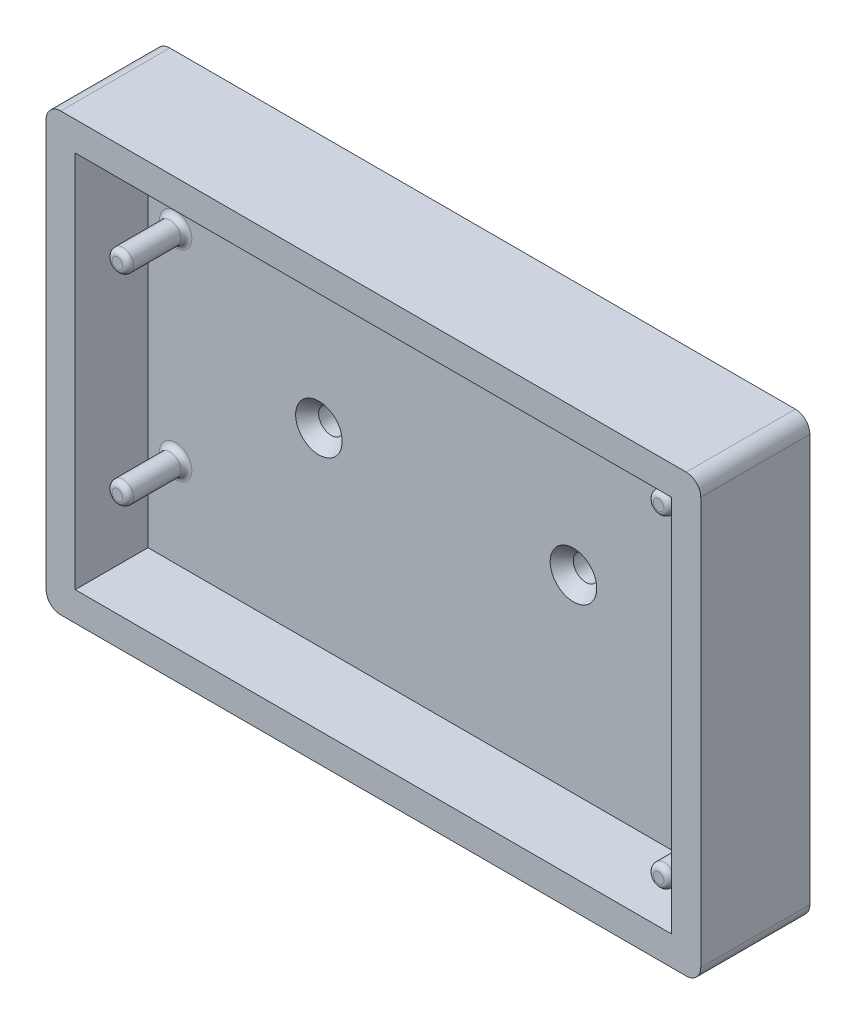
ISO-10303-21;
HEADER;
FILE_DESCRIPTION(('STEP AP214'),'2;1');
FILE_NAME('part.step','',(''),(''),'','','');
FILE_SCHEMA(('AUTOMOTIVE_DESIGN { 1 0 10303 214 1 1 1 1 }'));
ENDSEC;
DATA;
#1=APPLICATION_CONTEXT('core data for automotive mechanical design processes');
#2=APPLICATION_PROTOCOL_DEFINITION('international standard','automotive_design',2000,#1);
#3=PRODUCT_CONTEXT('',#1,'mechanical');
#4=PRODUCT('Part','Part','',(#3));
#5=PRODUCT_RELATED_PRODUCT_CATEGORY('part','',(#4));
#6=PRODUCT_DEFINITION_FORMATION('','',#4);
#7=PRODUCT_DEFINITION_CONTEXT('part definition',#1,'design');
#8=PRODUCT_DEFINITION('design','',#6,#7);
#9=PRODUCT_DEFINITION_SHAPE('','',#8);
#10=(LENGTH_UNIT() NAMED_UNIT(*) SI_UNIT(.MILLI.,.METRE.));
#11=(NAMED_UNIT(*) PLANE_ANGLE_UNIT() SI_UNIT($,.RADIAN.));
#12=(NAMED_UNIT(*) SI_UNIT($,.STERADIAN.) SOLID_ANGLE_UNIT());
#13=UNCERTAINTY_MEASURE_WITH_UNIT(LENGTH_MEASURE(1.E-05),#10,'distance_accuracy_value','');
#14=(GEOMETRIC_REPRESENTATION_CONTEXT(3) GLOBAL_UNCERTAINTY_ASSIGNED_CONTEXT((#13)) GLOBAL_UNIT_ASSIGNED_CONTEXT((#10,
#11,#12)) REPRESENTATION_CONTEXT('',''));
#15=CARTESIAN_POINT('',(0.,0.,0.));
#16=DIRECTION('',(0.,0.,1.));
#17=DIRECTION('',(1.,0.,0.));
#18=AXIS2_PLACEMENT_3D('',#15,#16,#17);
#19=CARTESIAN_POINT('',(-45.,30.,5.));
#20=DIRECTION('',(0.,1.,0.));
#21=DIRECTION('',(0.,0.,1.));
#22=AXIS2_PLACEMENT_3D('',#19,#20,#21);
#23=PLANE('',#22);
#24=DIRECTION('',(1.,0.,0.));
#25=VECTOR('',#24,1.);
#26=CARTESIAN_POINT('',(-45.,30.,0.));
#27=LINE('',#26,#25);
#28=CARTESIAN_POINT('',(-43.,30.,0.));
#29=VERTEX_POINT('',#28);
#30=CARTESIAN_POINT('',(43.,30.,0.));
#31=VERTEX_POINT('',#30);
#32=EDGE_CURVE('E178',#29,#31,#27,.T.);
#33=ORIENTED_EDGE('',*,*,#32,.F.);
#34=DIRECTION('',(0.,0.,-1.));
#35=VECTOR('',#34,1.);
#36=CARTESIAN_POINT('',(-43.,30.,15.));
#37=LINE('',#36,#35);
#38=CARTESIAN_POINT('',(-43.,30.,15.));
#39=VERTEX_POINT('',#38);
#40=EDGE_CURVE('E48',#29,#39,#37,.F.);
#41=ORIENTED_EDGE('',*,*,#40,.T.);
#42=DIRECTION('',(-1.,0.,0.));
#43=VECTOR('',#42,1.);
#44=CARTESIAN_POINT('',(-45.,30.,15.));
#45=LINE('',#44,#43);
#46=CARTESIAN_POINT('',(43.,30.,15.));
#47=VERTEX_POINT('',#46);
#48=EDGE_CURVE('E170',#47,#39,#45,.T.);
#49=ORIENTED_EDGE('',*,*,#48,.F.);
#50=DIRECTION('',(0.,0.,-1.));
#51=VECTOR('',#50,1.);
#52=CARTESIAN_POINT('',(43.,30.,5.));
#53=LINE('',#52,#51);
#54=EDGE_CURVE('E215',#47,#31,#53,.T.);
#55=ORIENTED_EDGE('',*,*,#54,.T.);
#56=EDGE_LOOP('',(#33,#41,#49,#55));
#57=FACE_BOUND('',#56,.T.);
#58=ADVANCED_FACE('F33',(#57),#23,.T.);
#59=CARTESIAN_POINT('',(-45.,30.,5.));
#60=DIRECTION('',(1.,0.,0.));
#61=DIRECTION('',(0.,1.,0.));
#62=AXIS2_PLACEMENT_3D('',#59,#60,#61);
#63=PLANE('',#62);
#64=DIRECTION('',(0.,-1.,0.));
#65=VECTOR('',#64,1.);
#66=CARTESIAN_POINT('',(-45.,30.,0.));
#67=LINE('',#66,#65);
#68=CARTESIAN_POINT('',(-45.,28.,0.));
#69=VERTEX_POINT('',#68);
#70=CARTESIAN_POINT('',(-45.,-28.,0.));
#71=VERTEX_POINT('',#70);
#72=EDGE_CURVE('E187',#69,#71,#67,.T.);
#73=ORIENTED_EDGE('',*,*,#72,.T.);
#74=DIRECTION('',(0.,0.,-1.));
#75=VECTOR('',#74,1.);
#76=CARTESIAN_POINT('',(-45.,-28.,5.));
#77=LINE('',#76,#75);
#78=CARTESIAN_POINT('',(-45.,-28.,15.));
#79=VERTEX_POINT('',#78);
#80=EDGE_CURVE('E206',#71,#79,#77,.F.);
#81=ORIENTED_EDGE('',*,*,#80,.T.);
#82=DIRECTION('',(0.,-1.,0.));
#83=VECTOR('',#82,1.);
#84=CARTESIAN_POINT('',(-45.,30.,15.));
#85=LINE('',#84,#83);
#86=CARTESIAN_POINT('',(-45.,28.,15.));
#87=VERTEX_POINT('',#86);
#88=EDGE_CURVE('E172',#87,#79,#85,.T.);
#89=ORIENTED_EDGE('',*,*,#88,.F.);
#90=DIRECTION('',(0.,0.,-1.));
#91=VECTOR('',#90,1.);
#92=CARTESIAN_POINT('',(-45.,28.,0.));
#93=LINE('',#92,#91);
#94=EDGE_CURVE('E203',#87,#69,#93,.T.);
#95=ORIENTED_EDGE('',*,*,#94,.T.);
#96=EDGE_LOOP('',(#73,#81,#89,#95));
#97=FACE_BOUND('',#96,.T.);
#98=ADVANCED_FACE('F284',(#97),#63,.F.);
#99=CARTESIAN_POINT('',(-45.,-30.,5.));
#100=DIRECTION('',(0.,1.,0.));
#101=DIRECTION('',(0.,0.,1.));
#102=AXIS2_PLACEMENT_3D('',#99,#100,#101);
#103=PLANE('',#102);
#104=DIRECTION('',(1.,0.,0.));
#105=VECTOR('',#104,1.);
#106=CARTESIAN_POINT('',(-45.,-30.,15.));
#107=LINE('',#106,#105);
#108=CARTESIAN_POINT('',(-43.,-30.,15.));
#109=VERTEX_POINT('',#108);
#110=CARTESIAN_POINT('',(43.,-30.,15.));
#111=VERTEX_POINT('',#110);
#112=EDGE_CURVE('E175',#109,#111,#107,.T.);
#113=ORIENTED_EDGE('',*,*,#112,.F.);
#114=DIRECTION('',(0.,0.,-1.));
#115=VECTOR('',#114,1.);
#116=CARTESIAN_POINT('',(-43.,-30.,5.));
#117=LINE('',#116,#115);
#118=CARTESIAN_POINT('',(-43.,-30.,0.));
#119=VERTEX_POINT('',#118);
#120=EDGE_CURVE('E192',#109,#119,#117,.T.);
#121=ORIENTED_EDGE('',*,*,#120,.T.);
#122=DIRECTION('',(1.,0.,0.));
#123=VECTOR('',#122,1.);
#124=CARTESIAN_POINT('',(-45.,-30.,0.));
#125=LINE('',#124,#123);
#126=CARTESIAN_POINT('',(43.,-30.,0.));
#127=VERTEX_POINT('',#126);
#128=EDGE_CURVE('E184',#119,#127,#125,.T.);
#129=ORIENTED_EDGE('',*,*,#128,.T.);
#130=DIRECTION('',(0.,0.,-1.));
#131=VECTOR('',#130,1.);
#132=CARTESIAN_POINT('',(43.,-30.,15.));
#133=LINE('',#132,#131);
#134=EDGE_CURVE('E190',#127,#111,#133,.F.);
#135=ORIENTED_EDGE('',*,*,#134,.T.);
#136=EDGE_LOOP('',(#113,#121,#129,#135));
#137=FACE_BOUND('',#136,.T.);
#138=ADVANCED_FACE('F289',(#137),#103,.F.);
#139=CARTESIAN_POINT('',(45.,30.,5.));
#140=DIRECTION('',(1.,0.,0.));
#141=DIRECTION('',(0.,0.,-1.));
#142=AXIS2_PLACEMENT_3D('',#139,#140,#141);
#143=PLANE('',#142);
#144=DIRECTION('',(0.,-1.,0.));
#145=VECTOR('',#144,1.);
#146=CARTESIAN_POINT('',(45.,30.,0.));
#147=LINE('',#146,#145);
#148=CARTESIAN_POINT('',(45.,28.,0.));
#149=VERTEX_POINT('',#148);
#150=CARTESIAN_POINT('',(45.,-28.,0.));
#151=VERTEX_POINT('',#150);
#152=EDGE_CURVE('E181',#149,#151,#147,.T.);
#153=ORIENTED_EDGE('',*,*,#152,.F.);
#154=DIRECTION('',(0.,0.,-1.));
#155=VECTOR('',#154,1.);
#156=CARTESIAN_POINT('',(45.,28.,5.));
#157=LINE('',#156,#155);
#158=CARTESIAN_POINT('',(45.,28.,15.));
#159=VERTEX_POINT('',#158);
#160=EDGE_CURVE('E222',#149,#159,#157,.F.);
#161=ORIENTED_EDGE('',*,*,#160,.T.);
#162=DIRECTION('',(0.,1.,0.));
#163=VECTOR('',#162,1.);
#164=CARTESIAN_POINT('',(45.,30.,15.));
#165=LINE('',#164,#163);
#166=CARTESIAN_POINT('',(45.,-28.,15.));
#167=VERTEX_POINT('',#166);
#168=EDGE_CURVE('E143',#167,#159,#165,.T.);
#169=ORIENTED_EDGE('',*,*,#168,.F.);
#170=DIRECTION('',(0.,0.,-1.));
#171=VECTOR('',#170,1.);
#172=CARTESIAN_POINT('',(45.,-28.,0.));
#173=LINE('',#172,#171);
#174=EDGE_CURVE('E219',#167,#151,#173,.T.);
#175=ORIENTED_EDGE('',*,*,#174,.T.);
#176=EDGE_LOOP('',(#153,#161,#169,#175));
#177=FACE_BOUND('',#176,.T.);
#178=ADVANCED_FACE('F294',(#177),#143,.T.);
#179=CARTESIAN_POINT('',(0.,0.,0.));
#180=DIRECTION('',(0.,0.,-1.));
#181=DIRECTION('',(-1.,0.,0.));
#182=AXIS2_PLACEMENT_3D('',#179,#180,#181);
#183=PLANE('',#182);
#184=CARTESIAN_POINT('',(-17.5,0.,0.));
#185=DIRECTION('',(0.,0.,1.));
#186=DIRECTION('',(1.,0.,0.));
#187=AXIS2_PLACEMENT_3D('',#184,#185,#186);
#188=CIRCLE('',#187,1.7272);
#189=CARTESIAN_POINT('',(-15.7728,0.,0.));
#190=VERTEX_POINT('',#189);
#191=EDGE_CURVE('E606',#190,#190,#188,.T.);
#192=ORIENTED_EDGE('',*,*,#191,.T.);
#193=EDGE_LOOP('',(#192));
#194=FACE_BOUND('',#193,.T.);
#195=CARTESIAN_POINT('',(17.5,0.,0.));
#196=DIRECTION('',(0.,0.,1.));
#197=DIRECTION('',(1.,0.,0.));
#198=AXIS2_PLACEMENT_3D('',#195,#196,#197);
#199=CIRCLE('',#198,1.7272);
#200=CARTESIAN_POINT('',(19.2272,0.,0.));
#201=VERTEX_POINT('',#200);
#202=EDGE_CURVE('E158',#201,#201,#199,.T.);
#203=ORIENTED_EDGE('',*,*,#202,.T.);
#204=EDGE_LOOP('',(#203));
#205=FACE_BOUND('',#204,.T.);
#206=ORIENTED_EDGE('',*,*,#128,.F.);
#207=CARTESIAN_POINT('',(-43.,-28.,0.));
#208=DIRECTION('',(0.,0.,-1.));
#209=DIRECTION('',(-1.,0.,0.));
#210=AXIS2_PLACEMENT_3D('',#207,#208,#209);
#211=CIRCLE('',#210,2.);
#212=EDGE_CURVE('E201',#119,#71,#211,.T.);
#213=ORIENTED_EDGE('',*,*,#212,.T.);
#214=ORIENTED_EDGE('',*,*,#72,.F.);
#215=CARTESIAN_POINT('',(-43.,28.,0.));
#216=DIRECTION('',(0.,0.,-1.));
#217=DIRECTION('',(-1.,0.,0.));
#218=AXIS2_PLACEMENT_3D('',#215,#216,#217);
#219=CIRCLE('',#218,2.);
#220=EDGE_CURVE('E199',#69,#29,#219,.T.);
#221=ORIENTED_EDGE('',*,*,#220,.T.);
#222=ORIENTED_EDGE('',*,*,#32,.T.);
#223=CARTESIAN_POINT('',(43.,28.,0.));
#224=DIRECTION('',(0.,0.,-1.));
#225=DIRECTION('',(-1.,0.,0.));
#226=AXIS2_PLACEMENT_3D('',#223,#224,#225);
#227=CIRCLE('',#226,2.);
#228=EDGE_CURVE('E197',#31,#149,#227,.T.);
#229=ORIENTED_EDGE('',*,*,#228,.T.);
#230=ORIENTED_EDGE('',*,*,#152,.T.);
#231=CARTESIAN_POINT('',(43.,-28.,0.));
#232=DIRECTION('',(0.,0.,-1.));
#233=DIRECTION('',(-1.,0.,0.));
#234=AXIS2_PLACEMENT_3D('',#231,#232,#233);
#235=CIRCLE('',#234,2.);
#236=EDGE_CURVE('E195',#151,#127,#235,.T.);
#237=ORIENTED_EDGE('',*,*,#236,.T.);
#238=EDGE_LOOP('',(#206,#213,#214,#221,#222,#229,#230,#237));
#239=FACE_BOUND('',#238,.T.);
#240=ADVANCED_FACE('F371',(#194,#205,#239),#183,.T.);
#241=CARTESIAN_POINT('',(0.,0.,15.));
#242=DIRECTION('',(0.,0.,1.));
#243=DIRECTION('',(1.,0.,0.));
#244=AXIS2_PLACEMENT_3D('',#241,#242,#243);
#245=PLANE('',#244);
#246=ORIENTED_EDGE('',*,*,#88,.T.);
#247=CARTESIAN_POINT('',(-43.,-28.,15.));
#248=DIRECTION('',(0.,0.,1.));
#249=DIRECTION('',(1.,0.,0.));
#250=AXIS2_PLACEMENT_3D('',#247,#248,#249);
#251=CIRCLE('',#250,2.);
#252=EDGE_CURVE('E213',#79,#109,#251,.T.);
#253=ORIENTED_EDGE('',*,*,#252,.T.);
#254=ORIENTED_EDGE('',*,*,#112,.T.);
#255=CARTESIAN_POINT('',(43.,-28.,15.));
#256=DIRECTION('',(0.,0.,1.));
#257=DIRECTION('',(1.,0.,0.));
#258=AXIS2_PLACEMENT_3D('',#255,#256,#257);
#259=CIRCLE('',#258,2.);
#260=EDGE_CURVE('E208',#111,#167,#259,.T.);
#261=ORIENTED_EDGE('',*,*,#260,.T.);
#262=ORIENTED_EDGE('',*,*,#168,.T.);
#263=CARTESIAN_POINT('',(43.,28.,15.));
#264=DIRECTION('',(0.,0.,1.));
#265=DIRECTION('',(1.,0.,0.));
#266=AXIS2_PLACEMENT_3D('',#263,#264,#265);
#267=CIRCLE('',#266,2.);
#268=EDGE_CURVE('E55',#159,#47,#267,.T.);
#269=ORIENTED_EDGE('',*,*,#268,.T.);
#270=ORIENTED_EDGE('',*,*,#48,.T.);
#271=CARTESIAN_POINT('',(-43.,28.,15.));
#272=DIRECTION('',(0.,0.,1.));
#273=DIRECTION('',(1.,0.,0.));
#274=AXIS2_PLACEMENT_3D('',#271,#272,#273);
#275=CIRCLE('',#274,2.);
#276=EDGE_CURVE('E211',#39,#87,#275,.T.);
#277=ORIENTED_EDGE('',*,*,#276,.T.);
#278=EDGE_LOOP('',(#246,#253,#254,#261,#262,#269,#270,#277));
#279=FACE_BOUND('',#278,.T.);
#280=DIRECTION('',(-1.,0.,0.));
#281=VECTOR('',#280,1.);
#282=CARTESIAN_POINT('',(-41.,26.,15.));
#283=LINE('',#282,#281);
#284=CARTESIAN_POINT('',(41.,26.,15.));
#285=VERTEX_POINT('',#284);
#286=CARTESIAN_POINT('',(-41.,26.,15.));
#287=VERTEX_POINT('',#286);
#288=EDGE_CURVE('E135',#285,#287,#283,.T.);
#289=ORIENTED_EDGE('',*,*,#288,.F.);
#290=DIRECTION('',(0.,1.,0.));
#291=VECTOR('',#290,1.);
#292=CARTESIAN_POINT('',(41.,26.,15.));
#293=LINE('',#292,#291);
#294=CARTESIAN_POINT('',(41.,-26.,15.));
#295=VERTEX_POINT('',#294);
#296=EDGE_CURVE('E125',#295,#285,#293,.T.);
#297=ORIENTED_EDGE('',*,*,#296,.F.);
#298=DIRECTION('',(1.,0.,0.));
#299=VECTOR('',#298,1.);
#300=CARTESIAN_POINT('',(-41.,-26.,15.));
#301=LINE('',#300,#299);
#302=CARTESIAN_POINT('',(-41.,-26.,15.));
#303=VERTEX_POINT('',#302);
#304=EDGE_CURVE('E151',#303,#295,#301,.T.);
#305=ORIENTED_EDGE('',*,*,#304,.F.);
#306=DIRECTION('',(0.,-1.,0.));
#307=VECTOR('',#306,1.);
#308=CARTESIAN_POINT('',(-41.,26.,15.));
#309=LINE('',#308,#307);
#310=EDGE_CURVE('E149',#287,#303,#309,.T.);
#311=ORIENTED_EDGE('',*,*,#310,.F.);
#312=EDGE_LOOP('',(#289,#297,#305,#311));
#313=FACE_BOUND('',#312,.T.);
#314=ADVANCED_FACE('F147',(#279,#313),#245,.T.);
#315=CARTESIAN_POINT('',(41.,26.,15.));
#316=DIRECTION('',(-1.,0.,0.));
#317=DIRECTION('',(0.,0.,1.));
#318=AXIS2_PLACEMENT_3D('',#315,#316,#317);
#319=PLANE('',#318);
#320=DIRECTION('',(0.,1.,0.));
#321=VECTOR('',#320,1.);
#322=CARTESIAN_POINT('',(41.,26.,5.));
#323=LINE('',#322,#321);
#324=CARTESIAN_POINT('',(41.,-26.,5.));
#325=VERTEX_POINT('',#324);
#326=CARTESIAN_POINT('',(41.,26.,5.));
#327=VERTEX_POINT('',#326);
#328=EDGE_CURVE('E156',#325,#327,#323,.T.);
#329=ORIENTED_EDGE('',*,*,#328,.F.);
#330=DIRECTION('',(0.,0.,-1.));
#331=VECTOR('',#330,1.);
#332=CARTESIAN_POINT('',(41.,-26.,15.));
#333=LINE('',#332,#331);
#334=EDGE_CURVE('E131',#295,#325,#333,.T.);
#335=ORIENTED_EDGE('',*,*,#334,.F.);
#336=ORIENTED_EDGE('',*,*,#296,.T.);
#337=DIRECTION('',(0.,0.,-1.));
#338=VECTOR('',#337,1.);
#339=CARTESIAN_POINT('',(41.,26.,15.));
#340=LINE('',#339,#338);
#341=EDGE_CURVE('E129',#285,#327,#340,.T.);
#342=ORIENTED_EDGE('',*,*,#341,.T.);
#343=EDGE_LOOP('',(#329,#335,#336,#342));
#344=FACE_BOUND('',#343,.T.);
#345=ADVANCED_FACE('F128',(#344),#319,.T.);
#346=CARTESIAN_POINT('',(-41.,26.,15.));
#347=DIRECTION('',(0.,-1.,0.));
#348=DIRECTION('',(0.,0.,-1.));
#349=AXIS2_PLACEMENT_3D('',#346,#347,#348);
#350=PLANE('',#349);
#351=DIRECTION('',(-1.,0.,0.));
#352=VECTOR('',#351,1.);
#353=CARTESIAN_POINT('',(-41.,26.,5.));
#354=LINE('',#353,#352);
#355=CARTESIAN_POINT('',(-41.,26.,5.));
#356=VERTEX_POINT('',#355);
#357=EDGE_CURVE('E142',#327,#356,#354,.T.);
#358=ORIENTED_EDGE('',*,*,#357,.F.);
#359=ORIENTED_EDGE('',*,*,#341,.F.);
#360=ORIENTED_EDGE('',*,*,#288,.T.);
#361=DIRECTION('',(0.,0.,-1.));
#362=VECTOR('',#361,1.);
#363=CARTESIAN_POINT('',(-41.,26.,15.));
#364=LINE('',#363,#362);
#365=EDGE_CURVE('E144',#287,#356,#364,.T.);
#366=ORIENTED_EDGE('',*,*,#365,.T.);
#367=EDGE_LOOP('',(#358,#359,#360,#366));
#368=FACE_BOUND('',#367,.T.);
#369=ADVANCED_FACE('F139',(#368),#350,.T.);
#370=CARTESIAN_POINT('',(-41.,26.,15.));
#371=DIRECTION('',(1.,0.,0.));
#372=DIRECTION('',(0.,0.,-1.));
#373=AXIS2_PLACEMENT_3D('',#370,#371,#372);
#374=PLANE('',#373);
#375=DIRECTION('',(0.,-1.,0.));
#376=VECTOR('',#375,1.);
#377=CARTESIAN_POINT('',(-41.,26.,5.));
#378=LINE('',#377,#376);
#379=CARTESIAN_POINT('',(-41.,-26.,5.));
#380=VERTEX_POINT('',#379);
#381=EDGE_CURVE('E160',#356,#380,#378,.T.);
#382=ORIENTED_EDGE('',*,*,#381,.F.);
#383=ORIENTED_EDGE('',*,*,#365,.F.);
#384=ORIENTED_EDGE('',*,*,#310,.T.);
#385=DIRECTION('',(0.,0.,-1.));
#386=VECTOR('',#385,1.);
#387=CARTESIAN_POINT('',(-41.,-26.,15.));
#388=LINE('',#387,#386);
#389=EDGE_CURVE('E166',#303,#380,#388,.T.);
#390=ORIENTED_EDGE('',*,*,#389,.T.);
#391=EDGE_LOOP('',(#382,#383,#384,#390));
#392=FACE_BOUND('',#391,.T.);
#393=ADVANCED_FACE('F360',(#392),#374,.T.);
#394=CARTESIAN_POINT('',(-41.,-26.,15.));
#395=DIRECTION('',(0.,1.,0.));
#396=DIRECTION('',(0.,0.,1.));
#397=AXIS2_PLACEMENT_3D('',#394,#395,#396);
#398=PLANE('',#397);
#399=DIRECTION('',(1.,0.,0.));
#400=VECTOR('',#399,1.);
#401=CARTESIAN_POINT('',(-41.,-26.,5.));
#402=LINE('',#401,#400);
#403=EDGE_CURVE('E136',#380,#325,#402,.T.);
#404=ORIENTED_EDGE('',*,*,#403,.F.);
#405=ORIENTED_EDGE('',*,*,#389,.F.);
#406=ORIENTED_EDGE('',*,*,#304,.T.);
#407=ORIENTED_EDGE('',*,*,#334,.T.);
#408=EDGE_LOOP('',(#404,#405,#406,#407));
#409=FACE_BOUND('',#408,.T.);
#410=ADVANCED_FACE('F357',(#409),#398,.T.);
#411=CARTESIAN_POINT('',(0.,0.,5.));
#412=DIRECTION('',(0.,0.,-1.));
#413=DIRECTION('',(-1.,0.,0.));
#414=AXIS2_PLACEMENT_3D('',#411,#412,#413);
#415=PLANE('',#414);
#416=CARTESIAN_POINT('',(37.2,22.2,5.));
#417=DIRECTION('',(0.,0.,-1.));
#418=DIRECTION('',(-1.,0.,0.));
#419=AXIS2_PLACEMENT_3D('',#416,#417,#418);
#420=CIRCLE('',#419,2.225);
#421=CARTESIAN_POINT('',(34.975,22.2,5.));
#422=VERTEX_POINT('',#421);
#423=EDGE_CURVE('E251',#422,#422,#420,.T.);
#424=ORIENTED_EDGE('',*,*,#423,.T.);
#425=EDGE_LOOP('',(#424));
#426=FACE_BOUND('',#425,.T.);
#427=CARTESIAN_POINT('',(-37.2,13.800000038,5.));
#428=DIRECTION('',(0.,0.,-1.));
#429=DIRECTION('',(-1.,0.,0.));
#430=AXIS2_PLACEMENT_3D('',#427,#428,#429);
#431=CIRCLE('',#430,2.225);
#432=CARTESIAN_POINT('',(-39.425,13.800000038,5.));
#433=VERTEX_POINT('',#432);
#434=EDGE_CURVE('E248',#433,#433,#431,.T.);
#435=ORIENTED_EDGE('',*,*,#434,.T.);
#436=EDGE_LOOP('',(#435));
#437=FACE_BOUND('',#436,.T.);
#438=CARTESIAN_POINT('',(-37.2,-13.800000038,5.));
#439=DIRECTION('',(0.,0.,-1.));
#440=DIRECTION('',(-1.,0.,0.));
#441=AXIS2_PLACEMENT_3D('',#438,#439,#440);
#442=CIRCLE('',#441,2.225);
#443=CARTESIAN_POINT('',(-39.425,-13.800000038,5.));
#444=VERTEX_POINT('',#443);
#445=EDGE_CURVE('E245',#444,#444,#442,.T.);
#446=ORIENTED_EDGE('',*,*,#445,.T.);
#447=EDGE_LOOP('',(#446));
#448=FACE_BOUND('',#447,.T.);
#449=CARTESIAN_POINT('',(37.2,-22.2,5.));
#450=DIRECTION('',(0.,0.,-1.));
#451=DIRECTION('',(-1.,0.,0.));
#452=AXIS2_PLACEMENT_3D('',#449,#450,#451);
#453=CIRCLE('',#452,2.225);
#454=CARTESIAN_POINT('',(34.975,-22.2,5.));
#455=VERTEX_POINT('',#454);
#456=EDGE_CURVE('E242',#455,#455,#453,.T.);
#457=ORIENTED_EDGE('',*,*,#456,.T.);
#458=EDGE_LOOP('',(#457));
#459=FACE_BOUND('',#458,.T.);
#460=CARTESIAN_POINT('',(-17.5,0.,5.));
#461=DIRECTION('',(0.,0.,1.));
#462=DIRECTION('',(1.,0.,0.));
#463=AXIS2_PLACEMENT_3D('',#460,#461,#462);
#464=CIRCLE('',#463,3.2004);
#465=CARTESIAN_POINT('',(-14.2996,0.,5.));
#466=VERTEX_POINT('',#465);
#467=EDGE_CURVE('E614',#466,#466,#464,.T.);
#468=ORIENTED_EDGE('',*,*,#467,.F.);
#469=EDGE_LOOP('',(#468));
#470=FACE_BOUND('',#469,.T.);
#471=CARTESIAN_POINT('',(17.5,0.,5.));
#472=DIRECTION('',(0.,0.,1.));
#473=DIRECTION('',(1.,0.,0.));
#474=AXIS2_PLACEMENT_3D('',#471,#472,#473);
#475=CIRCLE('',#474,3.2004);
#476=CARTESIAN_POINT('',(20.7004,0.,5.));
#477=VERTEX_POINT('',#476);
#478=EDGE_CURVE('E603',#477,#477,#475,.T.);
#479=ORIENTED_EDGE('',*,*,#478,.F.);
#480=EDGE_LOOP('',(#479));
#481=FACE_BOUND('',#480,.T.);
#482=ORIENTED_EDGE('',*,*,#403,.T.);
#483=ORIENTED_EDGE('',*,*,#328,.T.);
#484=ORIENTED_EDGE('',*,*,#357,.T.);
#485=ORIENTED_EDGE('',*,*,#381,.T.);
#486=EDGE_LOOP('',(#482,#483,#484,#485));
#487=FACE_BOUND('',#486,.T.);
#488=ADVANCED_FACE('F355',(#426,#437,#448,#459,#470,#481,#487),#415,.F.);
#489=CARTESIAN_POINT('',(-37.2,13.800000038,13.));
#490=DIRECTION('',(0.,0.,-1.));
#491=DIRECTION('',(-1.,0.,0.));
#492=AXIS2_PLACEMENT_3D('',#489,#490,#491);
#493=CYLINDRICAL_SURFACE('',#492,1.475);
#494=CARTESIAN_POINT('',(-37.2,13.800000038,12.25));
#495=DIRECTION('',(0.,0.,1.));
#496=DIRECTION('',(1.,0.,0.));
#497=AXIS2_PLACEMENT_3D('',#494,#495,#496);
#498=CIRCLE('',#497,1.475);
#499=CARTESIAN_POINT('',(-35.725,13.800000038,12.25));
#500=VERTEX_POINT('',#499);
#501=EDGE_CURVE('E239',#500,#500,#498,.F.);
#502=ORIENTED_EDGE('',*,*,#501,.T.);
#503=EDGE_LOOP('',(#502));
#504=FACE_BOUND('',#503,.T.);
#505=CARTESIAN_POINT('',(-37.2,13.800000038,5.75));
#506=DIRECTION('',(0.,0.,-1.));
#507=DIRECTION('',(-1.,0.,0.));
#508=AXIS2_PLACEMENT_3D('',#505,#506,#507);
#509=CIRCLE('',#508,1.475);
#510=CARTESIAN_POINT('',(-38.675,13.800000038,5.75));
#511=VERTEX_POINT('',#510);
#512=EDGE_CURVE('E236',#511,#511,#509,.F.);
#513=ORIENTED_EDGE('',*,*,#512,.T.);
#514=EDGE_LOOP('',(#513));
#515=FACE_BOUND('',#514,.T.);
#516=ADVANCED_FACE('F348',(#504,#515),#493,.T.);
#517=CARTESIAN_POINT('',(-37.2,13.800000038,13.));
#518=DIRECTION('',(0.,0.,1.));
#519=DIRECTION('',(1.,0.,0.));
#520=AXIS2_PLACEMENT_3D('',#517,#518,#519);
#521=PLANE('',#520);
#522=CARTESIAN_POINT('',(-37.2,13.800000038,13.));
#523=DIRECTION('',(0.,0.,1.));
#524=DIRECTION('',(1.,0.,0.));
#525=AXIS2_PLACEMENT_3D('',#522,#523,#524);
#526=CIRCLE('',#525,0.724999999999998);
#527=CARTESIAN_POINT('',(-36.475,13.800000038,13.));
#528=VERTEX_POINT('',#527);
#529=EDGE_CURVE('E233',#528,#528,#526,.T.);
#530=ORIENTED_EDGE('',*,*,#529,.T.);
#531=EDGE_LOOP('',(#530));
#532=FACE_BOUND('',#531,.T.);
#533=ADVANCED_FACE('F340',(#532),#521,.T.);
#534=CARTESIAN_POINT('',(-37.2,-13.800000038,13.));
#535=DIRECTION('',(0.,0.,-1.));
#536=DIRECTION('',(-1.,0.,0.));
#537=AXIS2_PLACEMENT_3D('',#534,#535,#536);
#538=CYLINDRICAL_SURFACE('',#537,1.475);
#539=CARTESIAN_POINT('',(-37.2,-13.800000038,5.75));
#540=DIRECTION('',(0.,0.,-1.));
#541=DIRECTION('',(-1.,0.,0.));
#542=AXIS2_PLACEMENT_3D('',#539,#540,#541);
#543=CIRCLE('',#542,1.475);
#544=CARTESIAN_POINT('',(-38.675,-13.800000038,5.75));
#545=VERTEX_POINT('',#544);
#546=EDGE_CURVE('E257',#545,#545,#543,.F.);
#547=ORIENTED_EDGE('',*,*,#546,.T.);
#548=EDGE_LOOP('',(#547));
#549=FACE_BOUND('',#548,.T.);
#550=CARTESIAN_POINT('',(-37.2,-13.800000038,12.25));
#551=DIRECTION('',(0.,0.,1.));
#552=DIRECTION('',(1.,0.,0.));
#553=AXIS2_PLACEMENT_3D('',#550,#551,#552);
#554=CIRCLE('',#553,1.475);
#555=CARTESIAN_POINT('',(-35.725,-13.800000038,12.25));
#556=VERTEX_POINT('',#555);
#557=EDGE_CURVE('E254',#556,#556,#554,.F.);
#558=ORIENTED_EDGE('',*,*,#557,.T.);
#559=EDGE_LOOP('',(#558));
#560=FACE_BOUND('',#559,.T.);
#561=ADVANCED_FACE('F337',(#549,#560),#538,.T.);
#562=CARTESIAN_POINT('',(-37.2,-13.800000038,13.));
#563=DIRECTION('',(0.,0.,1.));
#564=DIRECTION('',(1.,0.,0.));
#565=AXIS2_PLACEMENT_3D('',#562,#563,#564);
#566=PLANE('',#565);
#567=CARTESIAN_POINT('',(-37.2,-13.800000038,13.));
#568=DIRECTION('',(0.,0.,1.));
#569=DIRECTION('',(1.,0.,0.));
#570=AXIS2_PLACEMENT_3D('',#567,#568,#569);
#571=CIRCLE('',#570,0.724999999999998);
#572=CARTESIAN_POINT('',(-36.475,-13.800000038,13.));
#573=VERTEX_POINT('',#572);
#574=EDGE_CURVE('E41',#573,#573,#571,.T.);
#575=ORIENTED_EDGE('',*,*,#574,.T.);
#576=EDGE_LOOP('',(#575));
#577=FACE_BOUND('',#576,.T.);
#578=ADVANCED_FACE('F268',(#577),#566,.T.);
#579=CARTESIAN_POINT('',(37.2,-22.2,13.));
#580=DIRECTION('',(0.,0.,-1.));
#581=DIRECTION('',(-1.,0.,0.));
#582=AXIS2_PLACEMENT_3D('',#579,#580,#581);
#583=CYLINDRICAL_SURFACE('',#582,1.475);
#584=CARTESIAN_POINT('',(37.2,-22.2,5.75));
#585=DIRECTION('',(0.,0.,-1.));
#586=DIRECTION('',(-1.,0.,0.));
#587=AXIS2_PLACEMENT_3D('',#584,#585,#586);
#588=CIRCLE('',#587,1.475);
#589=CARTESIAN_POINT('',(35.725,-22.2,5.75));
#590=VERTEX_POINT('',#589);
#591=EDGE_CURVE('E263',#590,#590,#588,.F.);
#592=ORIENTED_EDGE('',*,*,#591,.T.);
#593=EDGE_LOOP('',(#592));
#594=FACE_BOUND('',#593,.T.);
#595=CARTESIAN_POINT('',(37.2,-22.2,12.25));
#596=DIRECTION('',(0.,0.,1.));
#597=DIRECTION('',(1.,0.,0.));
#598=AXIS2_PLACEMENT_3D('',#595,#596,#597);
#599=CIRCLE('',#598,1.475);
#600=CARTESIAN_POINT('',(38.675,-22.2,12.25));
#601=VERTEX_POINT('',#600);
#602=EDGE_CURVE('E260',#601,#601,#599,.F.);
#603=ORIENTED_EDGE('',*,*,#602,.T.);
#604=EDGE_LOOP('',(#603));
#605=FACE_BOUND('',#604,.T.);
#606=ADVANCED_FACE('F346',(#594,#605),#583,.T.);
#607=CARTESIAN_POINT('',(37.2,-22.2,13.));
#608=DIRECTION('',(0.,0.,1.));
#609=DIRECTION('',(1.,0.,0.));
#610=AXIS2_PLACEMENT_3D('',#607,#608,#609);
#611=PLANE('',#610);
#612=CARTESIAN_POINT('',(37.2,-22.2,13.));
#613=DIRECTION('',(0.,0.,1.));
#614=DIRECTION('',(1.,0.,0.));
#615=AXIS2_PLACEMENT_3D('',#612,#613,#614);
#616=CIRCLE('',#615,0.724999999999999);
#617=CARTESIAN_POINT('',(37.925,-22.2,13.));
#618=VERTEX_POINT('',#617);
#619=EDGE_CURVE('E11',#618,#618,#616,.T.);
#620=ORIENTED_EDGE('',*,*,#619,.T.);
#621=EDGE_LOOP('',(#620));
#622=FACE_BOUND('',#621,.T.);
#623=ADVANCED_FACE('F460',(#622),#611,.T.);
#624=CARTESIAN_POINT('',(37.2,22.2,13.));
#625=DIRECTION('',(0.,0.,-1.));
#626=DIRECTION('',(-1.,0.,0.));
#627=AXIS2_PLACEMENT_3D('',#624,#625,#626);
#628=CYLINDRICAL_SURFACE('',#627,1.475);
#629=CARTESIAN_POINT('',(37.2,22.2,12.25));
#630=DIRECTION('',(0.,0.,1.));
#631=DIRECTION('',(1.,0.,0.));
#632=AXIS2_PLACEMENT_3D('',#629,#630,#631);
#633=CIRCLE('',#632,1.475);
#634=CARTESIAN_POINT('',(38.675,22.2,12.25));
#635=VERTEX_POINT('',#634);
#636=EDGE_CURVE('E230',#635,#635,#633,.F.);
#637=ORIENTED_EDGE('',*,*,#636,.T.);
#638=EDGE_LOOP('',(#637));
#639=FACE_BOUND('',#638,.T.);
#640=CARTESIAN_POINT('',(37.2,22.2,5.75));
#641=DIRECTION('',(0.,0.,-1.));
#642=DIRECTION('',(-1.,0.,0.));
#643=AXIS2_PLACEMENT_3D('',#640,#641,#642);
#644=CIRCLE('',#643,1.475);
#645=CARTESIAN_POINT('',(35.725,22.2,5.75));
#646=VERTEX_POINT('',#645);
#647=EDGE_CURVE('E227',#646,#646,#644,.F.);
#648=ORIENTED_EDGE('',*,*,#647,.T.);
#649=EDGE_LOOP('',(#648));
#650=FACE_BOUND('',#649,.T.);
#651=ADVANCED_FACE('F469',(#639,#650),#628,.T.);
#652=CARTESIAN_POINT('',(37.2,22.2,13.));
#653=DIRECTION('',(0.,0.,1.));
#654=DIRECTION('',(1.,0.,0.));
#655=AXIS2_PLACEMENT_3D('',#652,#653,#654);
#656=PLANE('',#655);
#657=CARTESIAN_POINT('',(37.2,22.2,13.));
#658=DIRECTION('',(0.,0.,1.));
#659=DIRECTION('',(1.,0.,0.));
#660=AXIS2_PLACEMENT_3D('',#657,#658,#659);
#661=CIRCLE('',#660,0.724999999999999);
#662=CARTESIAN_POINT('',(37.925,22.2,13.));
#663=VERTEX_POINT('',#662);
#664=EDGE_CURVE('E224',#663,#663,#661,.T.);
#665=ORIENTED_EDGE('',*,*,#664,.T.);
#666=EDGE_LOOP('',(#665));
#667=FACE_BOUND('',#666,.T.);
#668=ADVANCED_FACE('F479',(#667),#656,.T.);
#669=CARTESIAN_POINT('',(17.5,0.,5.));
#670=DIRECTION('',(0.,0.,1.));
#671=DIRECTION('',(1.,0.,0.));
#672=AXIS2_PLACEMENT_3D('',#669,#670,#671);
#673=CYLINDRICAL_SURFACE('',#672,1.7272);
#674=ORIENTED_EDGE('',*,*,#202,.F.);
#675=EDGE_LOOP('',(#674));
#676=FACE_BOUND('',#675,.T.);
#677=CARTESIAN_POINT('',(17.5,0.,3.30527726248201));
#678=DIRECTION('',(0.,0.,1.));
#679=DIRECTION('',(1.,0.,0.));
#680=AXIS2_PLACEMENT_3D('',#677,#678,#679);
#681=CIRCLE('',#680,1.7272);
#682=CARTESIAN_POINT('',(19.2272,0.,3.30527726248201));
#683=VERTEX_POINT('',#682);
#684=EDGE_CURVE('E602',#683,#683,#681,.T.);
#685=ORIENTED_EDGE('',*,*,#684,.T.);
#686=EDGE_LOOP('',(#685));
#687=FACE_BOUND('',#686,.T.);
#688=ADVANCED_FACE('F489',(#676,#687),#673,.F.);
#689=CARTESIAN_POINT('',(17.5,0.,5.));
#690=DIRECTION('',(0.,0.,1.));
#691=DIRECTION('',(1.,0.,0.));
#692=AXIS2_PLACEMENT_3D('',#689,#690,#691);
#693=CONICAL_SURFACE('',#692,3.2004,0.715584993317675);
#694=ORIENTED_EDGE('',*,*,#684,.F.);
#695=EDGE_LOOP('',(#694));
#696=FACE_BOUND('',#695,.T.);
#697=ORIENTED_EDGE('',*,*,#478,.T.);
#698=EDGE_LOOP('',(#697));
#699=FACE_BOUND('',#698,.T.);
#700=ADVANCED_FACE('F566',(#696,#699),#693,.F.);
#701=CARTESIAN_POINT('',(-17.5,0.,5.));
#702=DIRECTION('',(0.,0.,1.));
#703=DIRECTION('',(1.,0.,0.));
#704=AXIS2_PLACEMENT_3D('',#701,#702,#703);
#705=CYLINDRICAL_SURFACE('',#704,1.7272);
#706=ORIENTED_EDGE('',*,*,#191,.F.);
#707=EDGE_LOOP('',(#706));
#708=FACE_BOUND('',#707,.T.);
#709=CARTESIAN_POINT('',(-17.5,0.,3.30527726248201));
#710=DIRECTION('',(0.,0.,1.));
#711=DIRECTION('',(1.,0.,0.));
#712=AXIS2_PLACEMENT_3D('',#709,#710,#711);
#713=CIRCLE('',#712,1.7272);
#714=CARTESIAN_POINT('',(-15.7728,0.,3.30527726248201));
#715=VERTEX_POINT('',#714);
#716=EDGE_CURVE('E611',#715,#715,#713,.T.);
#717=ORIENTED_EDGE('',*,*,#716,.T.);
#718=EDGE_LOOP('',(#717));
#719=FACE_BOUND('',#718,.T.);
#720=ADVANCED_FACE('F558',(#708,#719),#705,.F.);
#721=CARTESIAN_POINT('',(-17.5,0.,5.));
#722=DIRECTION('',(0.,0.,1.));
#723=DIRECTION('',(1.,0.,0.));
#724=AXIS2_PLACEMENT_3D('',#721,#722,#723);
#725=CONICAL_SURFACE('',#724,3.2004,0.715584993317675);
#726=ORIENTED_EDGE('',*,*,#716,.F.);
#727=EDGE_LOOP('',(#726));
#728=FACE_BOUND('',#727,.T.);
#729=ORIENTED_EDGE('',*,*,#467,.T.);
#730=EDGE_LOOP('',(#729));
#731=FACE_BOUND('',#730,.T.);
#732=ADVANCED_FACE('F300',(#728,#731),#725,.F.);
#733=CARTESIAN_POINT('',(-43.,-28.,5.));
#734=DIRECTION('',(0.,0.,-1.));
#735=DIRECTION('',(-1.,0.,0.));
#736=AXIS2_PLACEMENT_3D('',#733,#734,#735);
#737=CYLINDRICAL_SURFACE('',#736,2.);
#738=ORIENTED_EDGE('',*,*,#252,.F.);
#739=ORIENTED_EDGE('',*,*,#80,.F.);
#740=ORIENTED_EDGE('',*,*,#212,.F.);
#741=ORIENTED_EDGE('',*,*,#120,.F.);
#742=EDGE_LOOP('',(#738,#739,#740,#741));
#743=FACE_BOUND('',#742,.T.);
#744=ADVANCED_FACE('F296',(#743),#737,.T.);
#745=CARTESIAN_POINT('',(-43.,28.,5.));
#746=DIRECTION('',(0.,0.,1.));
#747=DIRECTION('',(1.,0.,0.));
#748=AXIS2_PLACEMENT_3D('',#745,#746,#747);
#749=CYLINDRICAL_SURFACE('',#748,2.);
#750=ORIENTED_EDGE('',*,*,#276,.F.);
#751=ORIENTED_EDGE('',*,*,#40,.F.);
#752=ORIENTED_EDGE('',*,*,#220,.F.);
#753=ORIENTED_EDGE('',*,*,#94,.F.);
#754=EDGE_LOOP('',(#750,#751,#752,#753));
#755=FACE_BOUND('',#754,.T.);
#756=ADVANCED_FACE('F299',(#755),#749,.T.);
#757=CARTESIAN_POINT('',(43.,28.,5.));
#758=DIRECTION('',(0.,0.,-1.));
#759=DIRECTION('',(-1.,0.,0.));
#760=AXIS2_PLACEMENT_3D('',#757,#758,#759);
#761=CYLINDRICAL_SURFACE('',#760,2.);
#762=ORIENTED_EDGE('',*,*,#268,.F.);
#763=ORIENTED_EDGE('',*,*,#160,.F.);
#764=ORIENTED_EDGE('',*,*,#228,.F.);
#765=ORIENTED_EDGE('',*,*,#54,.F.);
#766=EDGE_LOOP('',(#762,#763,#764,#765));
#767=FACE_BOUND('',#766,.T.);
#768=ADVANCED_FACE('F304',(#767),#761,.T.);
#769=CARTESIAN_POINT('',(43.,-28.,5.));
#770=DIRECTION('',(0.,0.,1.));
#771=DIRECTION('',(1.,0.,0.));
#772=AXIS2_PLACEMENT_3D('',#769,#770,#771);
#773=CYLINDRICAL_SURFACE('',#772,2.);
#774=ORIENTED_EDGE('',*,*,#260,.F.);
#775=ORIENTED_EDGE('',*,*,#134,.F.);
#776=ORIENTED_EDGE('',*,*,#236,.F.);
#777=ORIENTED_EDGE('',*,*,#174,.F.);
#778=EDGE_LOOP('',(#774,#775,#776,#777));
#779=FACE_BOUND('',#778,.T.);
#780=ADVANCED_FACE('F308',(#779),#773,.T.);
#781=CARTESIAN_POINT('',(37.2,22.2,12.25));
#782=DIRECTION('',(0.,0.,1.));
#783=DIRECTION('',(1.,0.,0.));
#784=AXIS2_PLACEMENT_3D('',#781,#782,#783);
#785=DEGENERATE_TOROIDAL_SURFACE('',#784,0.724999999999999,0.75,.T.);
#786=ORIENTED_EDGE('',*,*,#636,.F.);
#787=EDGE_LOOP('',(#786));
#788=FACE_BOUND('',#787,.T.);
#789=ORIENTED_EDGE('',*,*,#664,.F.);
#790=EDGE_LOOP('',(#789));
#791=FACE_BOUND('',#790,.T.);
#792=ADVANCED_FACE('F312',(#788,#791),#785,.T.);
#793=CARTESIAN_POINT('',(-37.2,13.800000038,12.25));
#794=DIRECTION('',(0.,0.,1.));
#795=DIRECTION('',(1.,0.,0.));
#796=AXIS2_PLACEMENT_3D('',#793,#794,#795);
#797=DEGENERATE_TOROIDAL_SURFACE('',#796,0.724999999999998,0.75,.T.);
#798=ORIENTED_EDGE('',*,*,#501,.F.);
#799=EDGE_LOOP('',(#798));
#800=FACE_BOUND('',#799,.T.);
#801=ORIENTED_EDGE('',*,*,#529,.F.);
#802=EDGE_LOOP('',(#801));
#803=FACE_BOUND('',#802,.T.);
#804=ADVANCED_FACE('F316',(#800,#803),#797,.T.);
#805=CARTESIAN_POINT('',(37.2,22.2,5.75));
#806=DIRECTION('',(0.,0.,-1.));
#807=DIRECTION('',(-1.,0.,0.));
#808=AXIS2_PLACEMENT_3D('',#805,#806,#807);
#809=TOROIDAL_SURFACE('',#808,2.225,0.75);
#810=ORIENTED_EDGE('',*,*,#423,.F.);
#811=EDGE_LOOP('',(#810));
#812=FACE_BOUND('',#811,.T.);
#813=ORIENTED_EDGE('',*,*,#647,.F.);
#814=EDGE_LOOP('',(#813));
#815=FACE_BOUND('',#814,.T.);
#816=ADVANCED_FACE('F320',(#812,#815),#809,.F.);
#817=CARTESIAN_POINT('',(-37.2,13.800000038,5.75));
#818=DIRECTION('',(0.,0.,-1.));
#819=DIRECTION('',(-1.,0.,0.));
#820=AXIS2_PLACEMENT_3D('',#817,#818,#819);
#821=TOROIDAL_SURFACE('',#820,2.225,0.75);
#822=ORIENTED_EDGE('',*,*,#434,.F.);
#823=EDGE_LOOP('',(#822));
#824=FACE_BOUND('',#823,.T.);
#825=ORIENTED_EDGE('',*,*,#512,.F.);
#826=EDGE_LOOP('',(#825));
#827=FACE_BOUND('',#826,.T.);
#828=ADVANCED_FACE('F324',(#824,#827),#821,.F.);
#829=CARTESIAN_POINT('',(-37.2,-13.800000038,5.75));
#830=DIRECTION('',(0.,0.,-1.));
#831=DIRECTION('',(-1.,0.,0.));
#832=AXIS2_PLACEMENT_3D('',#829,#830,#831);
#833=TOROIDAL_SURFACE('',#832,2.225,0.75);
#834=ORIENTED_EDGE('',*,*,#445,.F.);
#835=EDGE_LOOP('',(#834));
#836=FACE_BOUND('',#835,.T.);
#837=ORIENTED_EDGE('',*,*,#546,.F.);
#838=EDGE_LOOP('',(#837));
#839=FACE_BOUND('',#838,.T.);
#840=ADVANCED_FACE('F279',(#836,#839),#833,.F.);
#841=CARTESIAN_POINT('',(37.2,-22.2,5.75));
#842=DIRECTION('',(0.,0.,-1.));
#843=DIRECTION('',(-1.,0.,0.));
#844=AXIS2_PLACEMENT_3D('',#841,#842,#843);
#845=TOROIDAL_SURFACE('',#844,2.225,0.75);
#846=ORIENTED_EDGE('',*,*,#456,.F.);
#847=EDGE_LOOP('',(#846));
#848=FACE_BOUND('',#847,.T.);
#849=ORIENTED_EDGE('',*,*,#591,.F.);
#850=EDGE_LOOP('',(#849));
#851=FACE_BOUND('',#850,.T.);
#852=ADVANCED_FACE('F272',(#848,#851),#845,.F.);
#853=CARTESIAN_POINT('',(-37.2,-13.800000038,12.25));
#854=DIRECTION('',(0.,0.,1.));
#855=DIRECTION('',(1.,0.,0.));
#856=AXIS2_PLACEMENT_3D('',#853,#854,#855);
#857=DEGENERATE_TOROIDAL_SURFACE('',#856,0.724999999999998,0.75,.T.);
#858=ORIENTED_EDGE('',*,*,#557,.F.);
#859=EDGE_LOOP('',(#858));
#860=FACE_BOUND('',#859,.T.);
#861=ORIENTED_EDGE('',*,*,#574,.F.);
#862=EDGE_LOOP('',(#861));
#863=FACE_BOUND('',#862,.T.);
#864=ADVANCED_FACE('F270',(#860,#863),#857,.T.);
#865=CARTESIAN_POINT('',(37.2,-22.2,12.25));
#866=DIRECTION('',(0.,0.,1.));
#867=DIRECTION('',(1.,0.,0.));
#868=AXIS2_PLACEMENT_3D('',#865,#866,#867);
#869=DEGENERATE_TOROIDAL_SURFACE('',#868,0.724999999999999,0.75,.T.);
#870=ORIENTED_EDGE('',*,*,#602,.F.);
#871=EDGE_LOOP('',(#870));
#872=FACE_BOUND('',#871,.T.);
#873=ORIENTED_EDGE('',*,*,#619,.F.);
#874=EDGE_LOOP('',(#873));
#875=FACE_BOUND('',#874,.T.);
#876=ADVANCED_FACE('F35',(#872,#875),#869,.T.);
#877=CLOSED_SHELL('',(#58,#98,#138,#178,#240,#314,#345,#369,#393,#410,#488,#516,#533,#561,#578,
#606,#623,#651,#668,#688,#700,#720,#732,#744,#756,#768,#780,#792,#804,#816,#828,#840,#852,#864,#876));
#878=MANIFOLD_SOLID_BREP('B2',#877);
#879=ADVANCED_BREP_SHAPE_REPRESENTATION('',(#18,#878),#14);
#880=SHAPE_DEFINITION_REPRESENTATION(#9,#879);
ENDSEC;
END-ISO-10303-21;
